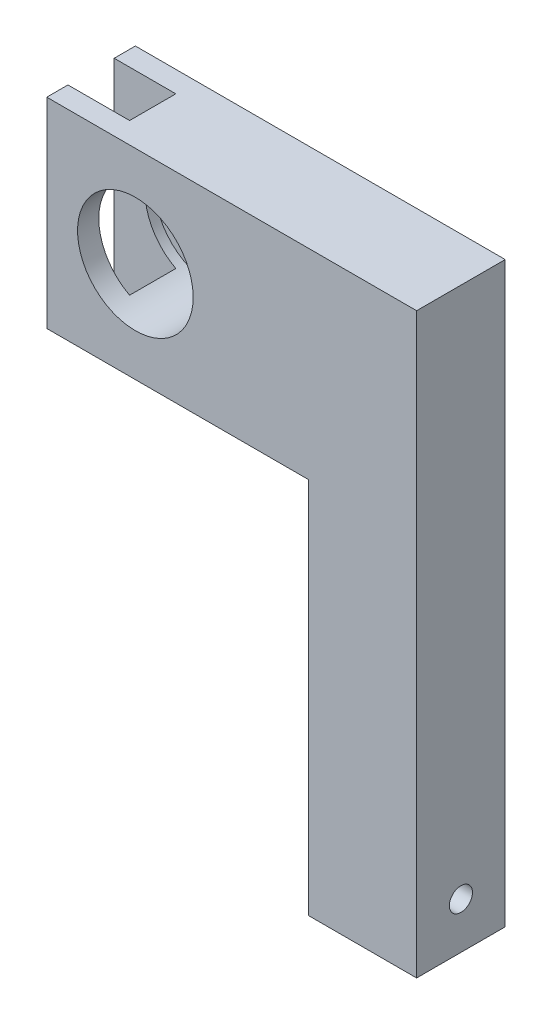
ISO-10303-21;
HEADER;
FILE_DESCRIPTION(('STEP AP214'),'2;1');
FILE_NAME('part.step','',(''),(''),'','','');
FILE_SCHEMA(('AUTOMOTIVE_DESIGN { 1 0 10303 214 1 1 1 1 }'));
ENDSEC;
DATA;
#1=APPLICATION_CONTEXT('core data for automotive mechanical design processes');
#2=APPLICATION_PROTOCOL_DEFINITION('international standard','automotive_design',2000,#1);
#3=PRODUCT_CONTEXT('',#1,'mechanical');
#4=PRODUCT('Part','Part','',(#3));
#5=PRODUCT_RELATED_PRODUCT_CATEGORY('part','',(#4));
#6=PRODUCT_DEFINITION_FORMATION('','',#4);
#7=PRODUCT_DEFINITION_CONTEXT('part definition',#1,'design');
#8=PRODUCT_DEFINITION('design','',#6,#7);
#9=PRODUCT_DEFINITION_SHAPE('','',#8);
#10=(LENGTH_UNIT() NAMED_UNIT(*) SI_UNIT(.MILLI.,.METRE.));
#11=(NAMED_UNIT(*) PLANE_ANGLE_UNIT() SI_UNIT($,.RADIAN.));
#12=(NAMED_UNIT(*) SI_UNIT($,.STERADIAN.) SOLID_ANGLE_UNIT());
#13=UNCERTAINTY_MEASURE_WITH_UNIT(LENGTH_MEASURE(1.E-05),#10,'distance_accuracy_value','');
#14=(GEOMETRIC_REPRESENTATION_CONTEXT(3) GLOBAL_UNCERTAINTY_ASSIGNED_CONTEXT((#13)) GLOBAL_UNIT_ASSIGNED_CONTEXT((#10,
#11,#12)) REPRESENTATION_CONTEXT('',''));
#15=CARTESIAN_POINT('',(0.,0.,0.));
#16=DIRECTION('',(0.,0.,1.));
#17=DIRECTION('',(1.,0.,0.));
#18=AXIS2_PLACEMENT_3D('',#15,#16,#17);
#19=CARTESIAN_POINT('',(0.,0.,23.));
#20=DIRECTION('',(1.,0.,0.));
#21=DIRECTION('',(0.,0.,-1.));
#22=AXIS2_PLACEMENT_3D('',#19,#20,#21);
#23=PLANE('',#22);
#24=DIRECTION('',(0.,1.,0.));
#25=VECTOR('',#24,1.);
#26=CARTESIAN_POINT('',(0.,-0.001000000000001,17.5));
#27=LINE('',#26,#25);
#28=CARTESIAN_POINT('',(0.,98.,17.5));
#29=VERTEX_POINT('',#28);
#30=CARTESIAN_POINT('',(0.,150.,17.5));
#31=VERTEX_POINT('',#30);
#32=EDGE_CURVE('E128',#29,#31,#27,.T.);
#33=ORIENTED_EDGE('',*,*,#32,.F.);
#34=DIRECTION('',(0.,0.,-1.));
#35=VECTOR('',#34,1.);
#36=CARTESIAN_POINT('',(0.,98.,23.));
#37=LINE('',#36,#35);
#38=CARTESIAN_POINT('',(0.,98.,23.));
#39=VERTEX_POINT('',#38);
#40=EDGE_CURVE('E50',#39,#29,#37,.T.);
#41=ORIENTED_EDGE('',*,*,#40,.F.);
#42=DIRECTION('',(0.,-1.,0.));
#43=VECTOR('',#42,1.);
#44=CARTESIAN_POINT('',(0.,0.,23.));
#45=LINE('',#44,#43);
#46=CARTESIAN_POINT('',(0.,150.,23.));
#47=VERTEX_POINT('',#46);
#48=EDGE_CURVE('E191',#47,#39,#45,.T.);
#49=ORIENTED_EDGE('',*,*,#48,.F.);
#50=DIRECTION('',(0.,0.,-1.));
#51=VECTOR('',#50,1.);
#52=CARTESIAN_POINT('',(0.,150.,23.));
#53=LINE('',#52,#51);
#54=EDGE_CURVE('E144',#47,#31,#53,.T.);
#55=ORIENTED_EDGE('',*,*,#54,.T.);
#56=EDGE_LOOP('',(#33,#41,#49,#55));
#57=FACE_BOUND('',#56,.T.);
#58=ADVANCED_FACE('F39',(#57),#23,.F.);
#59=CARTESIAN_POINT('',(0.,98.,23.));
#60=DIRECTION('',(0.,1.,0.));
#61=DIRECTION('',(0.,0.,1.));
#62=AXIS2_PLACEMENT_3D('',#59,#60,#61);
#63=PLANE('',#62);
#64=DIRECTION('',(1.,0.,0.));
#65=VECTOR('',#64,1.);
#66=CARTESIAN_POINT('',(0.,98.,5.50000000000001));
#67=LINE('',#66,#65);
#68=CARTESIAN_POINT('',(0.,98.,5.50000000000001));
#69=VERTEX_POINT('',#68);
#70=CARTESIAN_POINT('',(16.,98.,5.50000000000001));
#71=VERTEX_POINT('',#70);
#72=EDGE_CURVE('E214',#69,#71,#67,.T.);
#73=ORIENTED_EDGE('',*,*,#72,.F.);
#74=CARTESIAN_POINT('',(0.,98.,0.));
#75=VERTEX_POINT('',#74);
#76=EDGE_CURVE('E152',#69,#75,#37,.T.);
#77=ORIENTED_EDGE('',*,*,#76,.T.);
#78=DIRECTION('',(1.,0.,0.));
#79=VECTOR('',#78,1.);
#80=CARTESIAN_POINT('',(0.,98.,0.));
#81=LINE('',#80,#79);
#82=CARTESIAN_POINT('',(68.,98.,0.));
#83=VERTEX_POINT('',#82);
#84=EDGE_CURVE('E176',#75,#83,#81,.T.);
#85=ORIENTED_EDGE('',*,*,#84,.T.);
#86=DIRECTION('',(0.,0.,-1.));
#87=VECTOR('',#86,1.);
#88=CARTESIAN_POINT('',(68.,98.,23.));
#89=LINE('',#88,#87);
#90=CARTESIAN_POINT('',(68.,98.,23.));
#91=VERTEX_POINT('',#90);
#92=EDGE_CURVE('E154',#91,#83,#89,.T.);
#93=ORIENTED_EDGE('',*,*,#92,.F.);
#94=DIRECTION('',(1.,0.,0.));
#95=VECTOR('',#94,1.);
#96=CARTESIAN_POINT('',(0.,98.,23.));
#97=LINE('',#96,#95);
#98=EDGE_CURVE('E155',#39,#91,#97,.T.);
#99=ORIENTED_EDGE('',*,*,#98,.F.);
#100=ORIENTED_EDGE('',*,*,#40,.T.);
#101=DIRECTION('',(-1.,0.,0.));
#102=VECTOR('',#101,1.);
#103=CARTESIAN_POINT('',(0.,98.,17.5));
#104=LINE('',#103,#102);
#105=CARTESIAN_POINT('',(16.,98.,17.5));
#106=VERTEX_POINT('',#105);
#107=EDGE_CURVE('E130',#106,#29,#104,.T.);
#108=ORIENTED_EDGE('',*,*,#107,.F.);
#109=DIRECTION('',(0.,0.,1.));
#110=VECTOR('',#109,1.);
#111=CARTESIAN_POINT('',(16.,98.,5.50000000000001));
#112=LINE('',#111,#110);
#113=EDGE_CURVE('E217',#71,#106,#112,.T.);
#114=ORIENTED_EDGE('',*,*,#113,.F.);
#115=EDGE_LOOP('',(#73,#77,#85,#93,#99,#100,#108,#114));
#116=FACE_BOUND('',#115,.T.);
#117=ADVANCED_FACE('F147',(#116),#63,.F.);
#118=CARTESIAN_POINT('',(0.,150.,23.));
#119=DIRECTION('',(0.,-1.,0.));
#120=DIRECTION('',(0.,0.,-1.));
#121=AXIS2_PLACEMENT_3D('',#118,#119,#120);
#122=PLANE('',#121);
#123=DIRECTION('',(1.,0.,0.));
#124=VECTOR('',#123,1.);
#125=CARTESIAN_POINT('',(0.,150.,17.5));
#126=LINE('',#125,#124);
#127=CARTESIAN_POINT('',(16.,150.,17.5));
#128=VERTEX_POINT('',#127);
#129=EDGE_CURVE('E65',#31,#128,#126,.T.);
#130=ORIENTED_EDGE('',*,*,#129,.F.);
#131=ORIENTED_EDGE('',*,*,#54,.F.);
#132=DIRECTION('',(-1.,0.,0.));
#133=VECTOR('',#132,1.);
#134=CARTESIAN_POINT('',(0.,150.,23.));
#135=LINE('',#134,#133);
#136=CARTESIAN_POINT('',(96.,150.,23.));
#137=VERTEX_POINT('',#136);
#138=EDGE_CURVE('E187',#137,#47,#135,.T.);
#139=ORIENTED_EDGE('',*,*,#138,.F.);
#140=DIRECTION('',(0.,0.,-1.));
#141=VECTOR('',#140,1.);
#142=CARTESIAN_POINT('',(96.,150.,23.));
#143=LINE('',#142,#141);
#144=CARTESIAN_POINT('',(96.,150.,0.));
#145=VERTEX_POINT('',#144);
#146=EDGE_CURVE('E164',#137,#145,#143,.T.);
#147=ORIENTED_EDGE('',*,*,#146,.T.);
#148=DIRECTION('',(-1.,0.,0.));
#149=VECTOR('',#148,1.);
#150=CARTESIAN_POINT('',(0.,150.,0.));
#151=LINE('',#150,#149);
#152=CARTESIAN_POINT('',(0.,150.,0.));
#153=VERTEX_POINT('',#152);
#154=EDGE_CURVE('E168',#145,#153,#151,.T.);
#155=ORIENTED_EDGE('',*,*,#154,.T.);
#156=CARTESIAN_POINT('',(0.,150.,5.50000000000001));
#157=VERTEX_POINT('',#156);
#158=EDGE_CURVE('E166',#157,#153,#53,.T.);
#159=ORIENTED_EDGE('',*,*,#158,.F.);
#160=DIRECTION('',(-1.,0.,0.));
#161=VECTOR('',#160,1.);
#162=CARTESIAN_POINT('',(0.,150.,5.50000000000001));
#163=LINE('',#162,#161);
#164=CARTESIAN_POINT('',(16.,150.,5.50000000000001));
#165=VERTEX_POINT('',#164);
#166=EDGE_CURVE('E150',#165,#157,#163,.T.);
#167=ORIENTED_EDGE('',*,*,#166,.F.);
#168=DIRECTION('',(0.,0.,-1.));
#169=VECTOR('',#168,1.);
#170=CARTESIAN_POINT('',(16.,150.,5.50000000000001));
#171=LINE('',#170,#169);
#172=EDGE_CURVE('E215',#128,#165,#171,.T.);
#173=ORIENTED_EDGE('',*,*,#172,.F.);
#174=EDGE_LOOP('',(#130,#131,#139,#147,#155,#159,#167,#173));
#175=FACE_BOUND('',#174,.T.);
#176=ADVANCED_FACE('F251',(#175),#122,.F.);
#177=ORIENTED_EDGE('',*,*,#76,.F.);
#178=DIRECTION('',(0.,1.,0.));
#179=VECTOR('',#178,1.);
#180=CARTESIAN_POINT('',(0.,-0.001000000000001,5.50000000000001));
#181=LINE('',#180,#179);
#182=EDGE_CURVE('E204',#69,#157,#181,.T.);
#183=ORIENTED_EDGE('',*,*,#182,.T.);
#184=ORIENTED_EDGE('',*,*,#158,.T.);
#185=DIRECTION('',(0.,-1.,0.));
#186=VECTOR('',#185,1.);
#187=CARTESIAN_POINT('',(0.,0.,0.));
#188=LINE('',#187,#186);
#189=EDGE_CURVE('E185',#153,#75,#188,.T.);
#190=ORIENTED_EDGE('',*,*,#189,.T.);
#191=EDGE_LOOP('',(#177,#183,#184,#190));
#192=FACE_BOUND('',#191,.T.);
#193=ADVANCED_FACE('F265',(#192),#23,.F.);
#194=CARTESIAN_POINT('',(68.,0.,23.));
#195=DIRECTION('',(1.,0.,0.));
#196=DIRECTION('',(0.,0.,-1.));
#197=AXIS2_PLACEMENT_3D('',#194,#195,#196);
#198=PLANE('',#197);
#199=CARTESIAN_POINT('',(68.,12.,11.5));
#200=DIRECTION('',(1.,0.,0.));
#201=DIRECTION('',(0.,0.,-1.));
#202=AXIS2_PLACEMENT_3D('',#199,#200,#201);
#203=CIRCLE('',#202,3.);
#204=CARTESIAN_POINT('',(68.,12.,8.5));
#205=VERTEX_POINT('',#204);
#206=EDGE_CURVE('E226',#205,#205,#203,.F.);
#207=ORIENTED_EDGE('',*,*,#206,.F.);
#208=EDGE_LOOP('',(#207));
#209=FACE_BOUND('',#208,.T.);
#210=DIRECTION('',(0.,-1.,0.));
#211=VECTOR('',#210,1.);
#212=CARTESIAN_POINT('',(68.,0.,0.));
#213=LINE('',#212,#211);
#214=CARTESIAN_POINT('',(68.,0.,0.));
#215=VERTEX_POINT('',#214);
#216=EDGE_CURVE('E177',#83,#215,#213,.T.);
#217=ORIENTED_EDGE('',*,*,#216,.T.);
#218=DIRECTION('',(0.,0.,-1.));
#219=VECTOR('',#218,1.);
#220=CARTESIAN_POINT('',(68.,0.,23.));
#221=LINE('',#220,#219);
#222=CARTESIAN_POINT('',(68.,0.,23.));
#223=VERTEX_POINT('',#222);
#224=EDGE_CURVE('E157',#223,#215,#221,.T.);
#225=ORIENTED_EDGE('',*,*,#224,.F.);
#226=DIRECTION('',(0.,-1.,0.));
#227=VECTOR('',#226,1.);
#228=CARTESIAN_POINT('',(68.,0.,23.));
#229=LINE('',#228,#227);
#230=EDGE_CURVE('E194',#91,#223,#229,.T.);
#231=ORIENTED_EDGE('',*,*,#230,.F.);
#232=ORIENTED_EDGE('',*,*,#92,.T.);
#233=EDGE_LOOP('',(#217,#225,#231,#232));
#234=FACE_BOUND('',#233,.T.);
#235=ADVANCED_FACE('F274',(#209,#234),#198,.F.);
#236=CARTESIAN_POINT('',(0.,0.,23.));
#237=DIRECTION('',(0.,1.,0.));
#238=DIRECTION('',(0.,0.,1.));
#239=AXIS2_PLACEMENT_3D('',#236,#237,#238);
#240=PLANE('',#239);
#241=DIRECTION('',(1.,0.,0.));
#242=VECTOR('',#241,1.);
#243=CARTESIAN_POINT('',(0.,0.,0.));
#244=LINE('',#243,#242);
#245=CARTESIAN_POINT('',(96.,0.,0.));
#246=VERTEX_POINT('',#245);
#247=EDGE_CURVE('E178',#215,#246,#244,.T.);
#248=ORIENTED_EDGE('',*,*,#247,.T.);
#249=DIRECTION('',(0.,0.,-1.));
#250=VECTOR('',#249,1.);
#251=CARTESIAN_POINT('',(96.,0.,23.));
#252=LINE('',#251,#250);
#253=CARTESIAN_POINT('',(96.,0.,23.));
#254=VERTEX_POINT('',#253);
#255=EDGE_CURVE('E165',#254,#246,#252,.T.);
#256=ORIENTED_EDGE('',*,*,#255,.F.);
#257=DIRECTION('',(1.,0.,0.));
#258=VECTOR('',#257,1.);
#259=CARTESIAN_POINT('',(0.,0.,23.));
#260=LINE('',#259,#258);
#261=EDGE_CURVE('E188',#223,#254,#260,.T.);
#262=ORIENTED_EDGE('',*,*,#261,.F.);
#263=ORIENTED_EDGE('',*,*,#224,.T.);
#264=EDGE_LOOP('',(#248,#256,#262,#263));
#265=FACE_BOUND('',#264,.T.);
#266=ADVANCED_FACE('F245',(#265),#240,.F.);
#267=CARTESIAN_POINT('',(96.,0.,23.));
#268=DIRECTION('',(-1.,0.,0.));
#269=DIRECTION('',(0.,0.,1.));
#270=AXIS2_PLACEMENT_3D('',#267,#268,#269);
#271=PLANE('',#270);
#272=CARTESIAN_POINT('',(96.,12.,11.5));
#273=DIRECTION('',(1.,0.,0.));
#274=DIRECTION('',(0.,0.,-1.));
#275=AXIS2_PLACEMENT_3D('',#272,#273,#274);
#276=CIRCLE('',#275,3.);
#277=CARTESIAN_POINT('',(96.,12.,8.5));
#278=VERTEX_POINT('',#277);
#279=EDGE_CURVE('E234',#278,#278,#276,.T.);
#280=ORIENTED_EDGE('',*,*,#279,.F.);
#281=EDGE_LOOP('',(#280));
#282=FACE_BOUND('',#281,.T.);
#283=DIRECTION('',(0.,1.,0.));
#284=VECTOR('',#283,1.);
#285=CARTESIAN_POINT('',(96.,0.,0.));
#286=LINE('',#285,#284);
#287=EDGE_CURVE('E171',#246,#145,#286,.T.);
#288=ORIENTED_EDGE('',*,*,#287,.T.);
#289=ORIENTED_EDGE('',*,*,#146,.F.);
#290=DIRECTION('',(0.,1.,0.));
#291=VECTOR('',#290,1.);
#292=CARTESIAN_POINT('',(96.,0.,23.));
#293=LINE('',#292,#291);
#294=EDGE_CURVE('E189',#254,#137,#293,.T.);
#295=ORIENTED_EDGE('',*,*,#294,.F.);
#296=ORIENTED_EDGE('',*,*,#255,.T.);
#297=EDGE_LOOP('',(#288,#289,#295,#296));
#298=FACE_BOUND('',#297,.T.);
#299=ADVANCED_FACE('F239',(#282,#298),#271,.F.);
#300=CARTESIAN_POINT('',(23.,124.,23.));
#301=DIRECTION('',(0.,0.,-1.));
#302=DIRECTION('',(-1.,0.,0.));
#303=AXIS2_PLACEMENT_3D('',#300,#301,#302);
#304=CYLINDRICAL_SURFACE('',#303,15.);
#305=CARTESIAN_POINT('',(23.,124.,5.50000000000001));
#306=DIRECTION('',(0.,0.,-1.));
#307=DIRECTION('',(-1.,0.,0.));
#308=AXIS2_PLACEMENT_3D('',#305,#306,#307);
#309=CIRCLE('',#308,15.);
#310=CARTESIAN_POINT('',(16.,137.266499161422,5.50000000000001));
#311=VERTEX_POINT('',#310);
#312=CARTESIAN_POINT('',(16.,110.733500838578,5.50000000000001));
#313=VERTEX_POINT('',#312);
#314=EDGE_CURVE('E219',#311,#313,#309,.F.);
#315=ORIENTED_EDGE('',*,*,#314,.T.);
#316=DIRECTION('',(0.,0.,-1.));
#317=VECTOR('',#316,1.);
#318=CARTESIAN_POINT('',(16.,110.733500838578,23.));
#319=LINE('',#318,#317);
#320=CARTESIAN_POINT('',(16.,110.733500838578,17.5));
#321=VERTEX_POINT('',#320);
#322=EDGE_CURVE('E224',#313,#321,#319,.F.);
#323=ORIENTED_EDGE('',*,*,#322,.T.);
#324=CARTESIAN_POINT('',(23.,124.,17.5));
#325=DIRECTION('',(0.,0.,1.));
#326=DIRECTION('',(1.,0.,0.));
#327=AXIS2_PLACEMENT_3D('',#324,#325,#326);
#328=CIRCLE('',#327,15.);
#329=CARTESIAN_POINT('',(16.,137.266499161422,17.5));
#330=VERTEX_POINT('',#329);
#331=EDGE_CURVE('E137',#321,#330,#328,.F.);
#332=ORIENTED_EDGE('',*,*,#331,.T.);
#333=DIRECTION('',(0.,0.,-1.));
#334=VECTOR('',#333,1.);
#335=CARTESIAN_POINT('',(16.,137.266499161422,23.));
#336=LINE('',#335,#334);
#337=EDGE_CURVE('E227',#330,#311,#336,.T.);
#338=ORIENTED_EDGE('',*,*,#337,.T.);
#339=EDGE_LOOP('',(#315,#323,#332,#338));
#340=FACE_BOUND('',#339,.T.);
#341=CARTESIAN_POINT('',(23.,124.,3.));
#342=DIRECTION('',(0.,0.,1.));
#343=DIRECTION('',(1.,0.,0.));
#344=AXIS2_PLACEMENT_3D('',#341,#342,#343);
#345=CIRCLE('',#344,15.);
#346=CARTESIAN_POINT('',(38.,124.,3.));
#347=VERTEX_POINT('',#346);
#348=EDGE_CURVE('E11',#347,#347,#345,.T.);
#349=ORIENTED_EDGE('',*,*,#348,.F.);
#350=EDGE_LOOP('',(#349));
#351=FACE_BOUND('',#350,.T.);
#352=CARTESIAN_POINT('',(23.,124.,23.));
#353=DIRECTION('',(0.,0.,1.));
#354=DIRECTION('',(1.,0.,0.));
#355=AXIS2_PLACEMENT_3D('',#352,#353,#354);
#356=CIRCLE('',#355,15.);
#357=CARTESIAN_POINT('',(38.,124.,23.));
#358=VERTEX_POINT('',#357);
#359=EDGE_CURVE('E174',#358,#358,#356,.T.);
#360=ORIENTED_EDGE('',*,*,#359,.T.);
#361=EDGE_LOOP('',(#360));
#362=FACE_BOUND('',#361,.T.);
#363=ADVANCED_FACE('F41',(#340,#351,#362),#304,.F.);
#364=CARTESIAN_POINT('',(0.,0.,23.));
#365=DIRECTION('',(0.,0.,1.));
#366=DIRECTION('',(1.,0.,0.));
#367=AXIS2_PLACEMENT_3D('',#364,#365,#366);
#368=PLANE('',#367);
#369=ORIENTED_EDGE('',*,*,#359,.F.);
#370=EDGE_LOOP('',(#369));
#371=FACE_BOUND('',#370,.T.);
#372=ORIENTED_EDGE('',*,*,#48,.T.);
#373=ORIENTED_EDGE('',*,*,#98,.T.);
#374=ORIENTED_EDGE('',*,*,#230,.T.);
#375=ORIENTED_EDGE('',*,*,#261,.T.);
#376=ORIENTED_EDGE('',*,*,#294,.T.);
#377=ORIENTED_EDGE('',*,*,#138,.T.);
#378=EDGE_LOOP('',(#372,#373,#374,#375,#376,#377));
#379=FACE_BOUND('',#378,.T.);
#380=ADVANCED_FACE('F278',(#371,#379),#368,.T.);
#381=CARTESIAN_POINT('',(0.,0.,0.));
#382=DIRECTION('',(0.,0.,1.));
#383=DIRECTION('',(1.,0.,0.));
#384=AXIS2_PLACEMENT_3D('',#381,#382,#383);
#385=PLANE('',#384);
#386=ORIENTED_EDGE('',*,*,#189,.F.);
#387=ORIENTED_EDGE('',*,*,#154,.F.);
#388=ORIENTED_EDGE('',*,*,#287,.F.);
#389=ORIENTED_EDGE('',*,*,#247,.F.);
#390=ORIENTED_EDGE('',*,*,#216,.F.);
#391=ORIENTED_EDGE('',*,*,#84,.F.);
#392=EDGE_LOOP('',(#386,#387,#388,#389,#390,#391));
#393=FACE_BOUND('',#392,.T.);
#394=CARTESIAN_POINT('',(23.,124.,0.));
#395=DIRECTION('',(0.,0.,1.));
#396=DIRECTION('',(1.,0.,0.));
#397=AXIS2_PLACEMENT_3D('',#394,#395,#396);
#398=CIRCLE('',#397,6.);
#399=CARTESIAN_POINT('',(29.,124.,0.));
#400=VERTEX_POINT('',#399);
#401=EDGE_CURVE('E139',#400,#400,#398,.T.);
#402=ORIENTED_EDGE('',*,*,#401,.T.);
#403=EDGE_LOOP('',(#402));
#404=FACE_BOUND('',#403,.T.);
#405=ADVANCED_FACE('F258',(#393,#404),#385,.F.);
#406=CARTESIAN_POINT('',(23.,124.,3.));
#407=DIRECTION('',(0.,0.,-1.));
#408=DIRECTION('',(-1.,0.,0.));
#409=AXIS2_PLACEMENT_3D('',#406,#407,#408);
#410=CYLINDRICAL_SURFACE('',#409,6.);
#411=CARTESIAN_POINT('',(23.,124.,3.));
#412=DIRECTION('',(0.,0.,1.));
#413=DIRECTION('',(1.,0.,0.));
#414=AXIS2_PLACEMENT_3D('',#411,#412,#413);
#415=CIRCLE('',#414,6.);
#416=CARTESIAN_POINT('',(29.,124.,3.));
#417=VERTEX_POINT('',#416);
#418=EDGE_CURVE('E183',#417,#417,#415,.T.);
#419=ORIENTED_EDGE('',*,*,#418,.T.);
#420=EDGE_LOOP('',(#419));
#421=FACE_BOUND('',#420,.T.);
#422=ORIENTED_EDGE('',*,*,#401,.F.);
#423=EDGE_LOOP('',(#422));
#424=FACE_BOUND('',#423,.T.);
#425=ADVANCED_FACE('F287',(#421,#424),#410,.F.);
#426=CARTESIAN_POINT('',(0.,0.,3.));
#427=DIRECTION('',(0.,0.,1.));
#428=DIRECTION('',(1.,0.,0.));
#429=AXIS2_PLACEMENT_3D('',#426,#427,#428);
#430=PLANE('',#429);
#431=ORIENTED_EDGE('',*,*,#418,.F.);
#432=EDGE_LOOP('',(#431));
#433=FACE_BOUND('',#432,.T.);
#434=ORIENTED_EDGE('',*,*,#348,.T.);
#435=EDGE_LOOP('',(#434));
#436=FACE_BOUND('',#435,.T.);
#437=ADVANCED_FACE('F354',(#433,#436),#430,.T.);
#438=CARTESIAN_POINT('',(0.,-0.001000000000001,5.50000000000001));
#439=DIRECTION('',(0.,0.,-1.));
#440=DIRECTION('',(-1.,0.,0.));
#441=AXIS2_PLACEMENT_3D('',#438,#439,#440);
#442=PLANE('',#441);
#443=ORIENTED_EDGE('',*,*,#72,.T.);
#444=DIRECTION('',(0.,1.,0.));
#445=VECTOR('',#444,1.);
#446=CARTESIAN_POINT('',(16.,-0.001000000000001,5.50000000000001));
#447=LINE('',#446,#445);
#448=EDGE_CURVE('E208',#71,#313,#447,.T.);
#449=ORIENTED_EDGE('',*,*,#448,.T.);
#450=ORIENTED_EDGE('',*,*,#314,.F.);
#451=EDGE_CURVE('E53',#311,#165,#447,.T.);
#452=ORIENTED_EDGE('',*,*,#451,.T.);
#453=ORIENTED_EDGE('',*,*,#166,.T.);
#454=ORIENTED_EDGE('',*,*,#182,.F.);
#455=EDGE_LOOP('',(#443,#449,#450,#452,#453,#454));
#456=FACE_BOUND('',#455,.T.);
#457=ADVANCED_FACE('F266',(#456),#442,.F.);
#458=CARTESIAN_POINT('',(16.,-0.001000000000001,5.50000000000001));
#459=DIRECTION('',(1.,0.,0.));
#460=DIRECTION('',(0.,0.,-1.));
#461=AXIS2_PLACEMENT_3D('',#458,#459,#460);
#462=PLANE('',#461);
#463=ORIENTED_EDGE('',*,*,#113,.T.);
#464=DIRECTION('',(0.,1.,0.));
#465=VECTOR('',#464,1.);
#466=CARTESIAN_POINT('',(16.,-0.001000000000001,17.5));
#467=LINE('',#466,#465);
#468=EDGE_CURVE('E135',#106,#321,#467,.T.);
#469=ORIENTED_EDGE('',*,*,#468,.T.);
#470=ORIENTED_EDGE('',*,*,#322,.F.);
#471=ORIENTED_EDGE('',*,*,#448,.F.);
#472=EDGE_LOOP('',(#463,#469,#470,#471));
#473=FACE_BOUND('',#472,.T.);
#474=ADVANCED_FACE('F275',(#473),#462,.F.);
#475=CARTESIAN_POINT('',(0.,-0.001000000000001,17.5));
#476=DIRECTION('',(0.,0.,1.));
#477=DIRECTION('',(1.,0.,0.));
#478=AXIS2_PLACEMENT_3D('',#475,#476,#477);
#479=PLANE('',#478);
#480=ORIENTED_EDGE('',*,*,#107,.T.);
#481=ORIENTED_EDGE('',*,*,#32,.T.);
#482=ORIENTED_EDGE('',*,*,#129,.T.);
#483=EDGE_CURVE('E148',#330,#128,#467,.T.);
#484=ORIENTED_EDGE('',*,*,#483,.F.);
#485=ORIENTED_EDGE('',*,*,#331,.F.);
#486=ORIENTED_EDGE('',*,*,#468,.F.);
#487=EDGE_LOOP('',(#480,#481,#482,#484,#485,#486));
#488=FACE_BOUND('',#487,.T.);
#489=ADVANCED_FACE('F129',(#488),#479,.F.);
#490=ORIENTED_EDGE('',*,*,#483,.T.);
#491=ORIENTED_EDGE('',*,*,#172,.T.);
#492=ORIENTED_EDGE('',*,*,#451,.F.);
#493=ORIENTED_EDGE('',*,*,#337,.F.);
#494=EDGE_LOOP('',(#490,#491,#492,#493));
#495=FACE_BOUND('',#494,.T.);
#496=ADVANCED_FACE('F268',(#495),#462,.F.);
#497=CARTESIAN_POINT('',(-0.001000000000001,12.,11.5));
#498=DIRECTION('',(1.,0.,0.));
#499=DIRECTION('',(0.,0.,-1.));
#500=AXIS2_PLACEMENT_3D('',#497,#498,#499);
#501=CYLINDRICAL_SURFACE('',#500,3.);
#502=CARTESIAN_POINT('',(96.,12.,8.5));
#503=CARTESIAN_POINT('',(95.7083333333334,12.,8.5));
#504=CARTESIAN_POINT('',(95.4166666666667,12.,8.5));
#505=CARTESIAN_POINT('',(94.8333333333334,12.,8.5));
#506=CARTESIAN_POINT('',(94.5416666666667,12.,8.5));
#507=CARTESIAN_POINT('',(93.9583333333334,12.,8.5));
#508=CARTESIAN_POINT('',(93.6666666666667,12.,8.5));
#509=CARTESIAN_POINT('',(93.0833333333334,12.,8.5));
#510=CARTESIAN_POINT('',(92.7916666666667,12.,8.5));
#511=CARTESIAN_POINT('',(92.2083333333334,12.,8.5));
#512=CARTESIAN_POINT('',(91.9166666666667,12.,8.5));
#513=CARTESIAN_POINT('',(91.3333333333333,12.,8.5));
#514=CARTESIAN_POINT('',(91.0416666666667,12.,8.5));
#515=CARTESIAN_POINT('',(90.4583333333333,12.,8.5));
#516=CARTESIAN_POINT('',(90.1666666666667,12.,8.5));
#517=CARTESIAN_POINT('',(89.5833333333333,12.,8.5));
#518=CARTESIAN_POINT('',(89.2916666666667,12.,8.5));
#519=CARTESIAN_POINT('',(88.7083333333333,12.,8.5));
#520=CARTESIAN_POINT('',(88.4166666666667,12.,8.5));
#521=CARTESIAN_POINT('',(87.8333333333334,12.,8.5));
#522=CARTESIAN_POINT('',(87.5416666666667,12.,8.5));
#523=CARTESIAN_POINT('',(86.9583333333334,12.,8.5));
#524=CARTESIAN_POINT('',(86.6666666666667,12.,8.5));
#525=CARTESIAN_POINT('',(86.0833333333334,12.,8.5));
#526=CARTESIAN_POINT('',(85.7916666666667,12.,8.5));
#527=CARTESIAN_POINT('',(85.2083333333334,12.,8.5));
#528=CARTESIAN_POINT('',(84.9166666666667,12.,8.5));
#529=CARTESIAN_POINT('',(84.3333333333334,12.,8.5));
#530=CARTESIAN_POINT('',(84.0416666666667,12.,8.5));
#531=CARTESIAN_POINT('',(83.4583333333334,12.,8.5));
#532=CARTESIAN_POINT('',(83.1666666666667,12.,8.5));
#533=CARTESIAN_POINT('',(82.5833333333334,12.,8.5));
#534=CARTESIAN_POINT('',(82.2916666666667,12.,8.5));
#535=CARTESIAN_POINT('',(81.7083333333334,12.,8.5));
#536=CARTESIAN_POINT('',(81.4166666666667,12.,8.5));
#537=CARTESIAN_POINT('',(80.8333333333334,12.,8.5));
#538=CARTESIAN_POINT('',(80.5416666666667,12.,8.5));
#539=CARTESIAN_POINT('',(79.9583333333334,12.,8.5));
#540=CARTESIAN_POINT('',(79.6666666666667,12.,8.5));
#541=CARTESIAN_POINT('',(79.0833333333334,12.,8.5));
#542=CARTESIAN_POINT('',(78.7916666666667,12.,8.5));
#543=CARTESIAN_POINT('',(78.2083333333334,12.,8.5));
#544=CARTESIAN_POINT('',(77.9166666666667,12.,8.5));
#545=CARTESIAN_POINT('',(77.3333333333334,12.,8.5));
#546=CARTESIAN_POINT('',(77.0416666666667,12.,8.5));
#547=CARTESIAN_POINT('',(76.4583333333334,12.,8.5));
#548=CARTESIAN_POINT('',(76.1666666666667,12.,8.5));
#549=CARTESIAN_POINT('',(75.5833333333333,12.,8.5));
#550=CARTESIAN_POINT('',(75.2916666666667,12.,8.5));
#551=CARTESIAN_POINT('',(74.7083333333333,12.,8.5));
#552=CARTESIAN_POINT('',(74.4166666666667,12.,8.5));
#553=CARTESIAN_POINT('',(73.8333333333333,12.,8.5));
#554=CARTESIAN_POINT('',(73.5416666666667,12.,8.5));
#555=CARTESIAN_POINT('',(72.9583333333334,12.,8.5));
#556=CARTESIAN_POINT('',(72.6666666666667,12.,8.5));
#557=CARTESIAN_POINT('',(72.0833333333334,12.,8.5));
#558=CARTESIAN_POINT('',(71.7916666666667,12.,8.5));
#559=CARTESIAN_POINT('',(71.2083333333334,12.,8.5));
#560=CARTESIAN_POINT('',(70.9166666666667,12.,8.5));
#561=CARTESIAN_POINT('',(70.3333333333334,12.,8.5));
#562=CARTESIAN_POINT('',(70.0416666666667,12.,8.5));
#563=CARTESIAN_POINT('',(69.4583333333334,12.,8.5));
#564=CARTESIAN_POINT('',(69.1666666666667,12.,8.5));
#565=CARTESIAN_POINT('',(68.5833333333334,12.,8.5));
#566=CARTESIAN_POINT('',(68.2916666666667,12.,8.5));
#567=CARTESIAN_POINT('',(68.,12.,8.5));
#568=B_SPLINE_CURVE_WITH_KNOTS('',3,(#502,#503,#504,#505,#506,#507,#508,#509,#510,#511,#512,
#513,#514,#515,#516,#517,#518,#519,#520,#521,#522,#523,#524,#525,#526,#527,#528,#529,#530,#531,
#532,#533,#534,#535,#536,#537,#538,#539,#540,#541,#542,#543,#544,#545,#546,#547,#548,#549,#550,
#551,#552,#553,#554,#555,#556,#557,#558,#559,#560,#561,#562,#563,#564,#565,#566,#567),
.UNSPECIFIED.,.F.,.F.,(4,2,2,2,2,2,2,2,2,2,2,2,2,2,2,2,2,2,2,2,2,2,2,2,2,2,2,2,2,2,2,2,4),(0.,
0.875000000000001,1.75,2.625,3.5,4.375,5.25,6.12500000000001,7.00000000000001,7.87499999999999,
8.74999999999999,9.62499999999999,10.5,11.375,12.25,13.125,14.,14.875,15.75,16.625,17.5,18.375,
19.25,20.125,21.,21.875,22.75,23.625,24.5,25.375,26.25,27.125,28.),.UNSPECIFIED.);
#569=EDGE_CURVE('BSEAM237',#278,#205,#568,.T.);
#570=ORIENTED_EDGE('',*,*,#279,.T.);
#571=ORIENTED_EDGE('',*,*,#206,.T.);
#572=ORIENTED_EDGE('',*,*,#569,.T.);
#573=ORIENTED_EDGE('',*,*,#569,.F.);
#574=EDGE_LOOP('',(#570,#572,#571,#573));
#575=FACE_BOUND('',#574,.T.);
#576=ADVANCED_FACE('F237',(#575),#501,.F.);
#577=CLOSED_SHELL('',(#58,#117,#176,#193,#235,#266,#299,#363,#380,#405,#425,#437,#457,#474,#489,
#496,#576));
#578=MANIFOLD_SOLID_BREP('B2',#577);
#579=ADVANCED_BREP_SHAPE_REPRESENTATION('',(#18,#578),#14);
#580=SHAPE_DEFINITION_REPRESENTATION(#9,#579);
ENDSEC;
END-ISO-10303-21;
